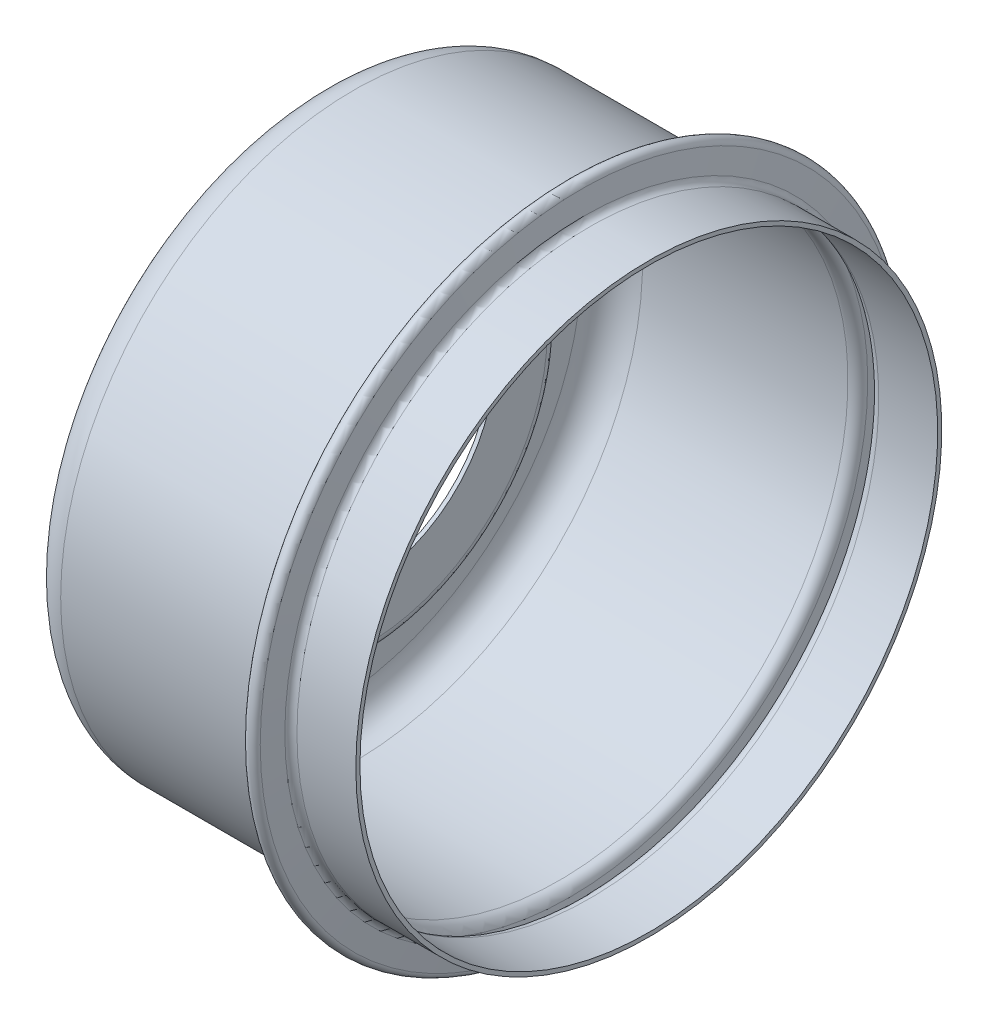
ISO-10303-21;
HEADER;
FILE_DESCRIPTION(('STEP AP214'),'2;1');
FILE_NAME('part.step','',(''),(''),'','','');
FILE_SCHEMA(('AUTOMOTIVE_DESIGN { 1 0 10303 214 1 1 1 1 }'));
ENDSEC;
DATA;
#1=APPLICATION_CONTEXT('core data for automotive mechanical design processes');
#2=APPLICATION_PROTOCOL_DEFINITION('international standard','automotive_design',2000,#1);
#3=PRODUCT_CONTEXT('',#1,'mechanical');
#4=PRODUCT('Part','Part','',(#3));
#5=PRODUCT_RELATED_PRODUCT_CATEGORY('part','',(#4));
#6=PRODUCT_DEFINITION_FORMATION('','',#4);
#7=PRODUCT_DEFINITION_CONTEXT('part definition',#1,'design');
#8=PRODUCT_DEFINITION('design','',#6,#7);
#9=PRODUCT_DEFINITION_SHAPE('','',#8);
#10=(LENGTH_UNIT() NAMED_UNIT(*) SI_UNIT(.MILLI.,.METRE.));
#11=(NAMED_UNIT(*) PLANE_ANGLE_UNIT() SI_UNIT($,.RADIAN.));
#12=(NAMED_UNIT(*) SI_UNIT($,.STERADIAN.) SOLID_ANGLE_UNIT());
#13=UNCERTAINTY_MEASURE_WITH_UNIT(LENGTH_MEASURE(1.E-05),#10,'distance_accuracy_value','');
#14=(GEOMETRIC_REPRESENTATION_CONTEXT(3) GLOBAL_UNCERTAINTY_ASSIGNED_CONTEXT((#13)) GLOBAL_UNIT_ASSIGNED_CONTEXT((#10,
#11,#12)) REPRESENTATION_CONTEXT('',''));
#15=CARTESIAN_POINT('',(0.,0.,0.));
#16=DIRECTION('',(0.,0.,1.));
#17=DIRECTION('',(1.,0.,0.));
#18=AXIS2_PLACEMENT_3D('',#15,#16,#17);
#19=CARTESIAN_POINT('',(-123.740209105341,2.22044604925031E-13,7.7715611723761E-13));
#20=DIRECTION('',(-1.,0.,0.));
#21=DIRECTION('',(0.,0.,1.));
#22=AXIS2_PLACEMENT_3D('',#19,#20,#21);
#23=CYLINDRICAL_SURFACE('',#22,34.0614);
#24=CARTESIAN_POINT('',(23.1988483706919,2.22044604925031E-13,-4.44089209850063E-13));
#25=DIRECTION('',(-1.,0.,0.));
#26=DIRECTION('',(0.,0.,1.));
#27=AXIS2_PLACEMENT_3D('',#24,#25,#26);
#28=CIRCLE('',#27,34.0614);
#29=CARTESIAN_POINT('',(23.1988483706919,2.27716967504676E-13,34.0613999999996));
#30=VERTEX_POINT('',#29);
#31=EDGE_CURVE('E650',#30,#30,#28,.T.);
#32=ORIENTED_EDGE('',*,*,#31,.F.);
#33=EDGE_LOOP('',(#32));
#34=FACE_BOUND('',#33,.T.);
#35=CARTESIAN_POINT('',(-1.01600000000002,2.22044604925031E-13,-1.11022302462516E-13));
#36=DIRECTION('',(-1.,0.,0.));
#37=DIRECTION('',(0.,0.,1.));
#38=AXIS2_PLACEMENT_3D('',#35,#36,#37);
#39=CIRCLE('',#38,34.0614);
#40=CARTESIAN_POINT('',(-1.01600000000001,2.27716967504676E-13,34.0613999999999));
#41=VERTEX_POINT('',#40);
#42=EDGE_CURVE('E653',#41,#41,#39,.T.);
#43=ORIENTED_EDGE('',*,*,#42,.T.);
#44=EDGE_LOOP('',(#43));
#45=FACE_BOUND('',#44,.T.);
#46=ADVANCED_FACE('F17',(#34,#45),#23,.F.);
#47=CARTESIAN_POINT('',(23.1988483706919,2.22044604925031E-13,-4.44089209850063E-13));
#48=DIRECTION('',(-1.,0.,0.));
#49=DIRECTION('',(0.,0.,1.));
#50=AXIS2_PLACEMENT_3D('',#47,#48,#49);
#51=TOROIDAL_SURFACE('',#50,35.3060000000011,1.2446);
#52=ORIENTED_EDGE('',*,*,#31,.T.);
#53=EDGE_LOOP('',(#52));
#54=FACE_BOUND('',#53,.T.);
#55=CARTESIAN_POINT('',(24.4348259992161,4.44089209850063E-13,1.11022302462516E-13));
#56=DIRECTION('',(1.,0.,0.));
#57=DIRECTION('',(0.,0.,-1.));
#58=AXIS2_PLACEMENT_3D('',#55,#56,#57);
#59=CIRCLE('',#58,35.1597520537313);
#60=CARTESIAN_POINT('',(24.4348259992161,4.38233934909538E-13,-35.1597520537312));
#61=VERTEX_POINT('',#60);
#62=EDGE_CURVE('E76',#61,#61,#59,.T.);
#63=ORIENTED_EDGE('',*,*,#62,.T.);
#64=EDGE_LOOP('',(#63));
#65=FACE_BOUND('',#64,.T.);
#66=ADVANCED_FACE('F621',(#54,#65),#51,.T.);
#67=CARTESIAN_POINT('',(-1.01600000000035,2.22044604925031E-13,-1.11022302462516E-13));
#68=DIRECTION('',(-1.,0.,0.));
#69=DIRECTION('',(0.,0.,1.));
#70=AXIS2_PLACEMENT_3D('',#67,#68,#69);
#71=TOROIDAL_SURFACE('',#70,30.48,3.5814);
#72=ORIENTED_EDGE('',*,*,#42,.F.);
#73=EDGE_LOOP('',(#72));
#74=FACE_BOUND('',#73,.T.);
#75=CARTESIAN_POINT('',(-4.59740000000036,2.2254162401758E-13,-1.11221110099535E-13));
#76=DIRECTION('',(-1.,0.,0.));
#77=DIRECTION('',(0.,0.,-1.));
#78=AXIS2_PLACEMENT_3D('',#75,#76,#77);
#79=CIRCLE('',#78,30.48);
#80=CARTESIAN_POINT('',(-4.59740000000031,2.22044604925031E-13,-30.4799999999999));
#81=VERTEX_POINT('',#80);
#82=CARTESIAN_POINT('',(-4.59740000000031,2.22044604925031E-13,30.4800000000006));
#83=VERTEX_POINT('',#82);
#84=EDGE_CURVE('E72',#81,#83,#79,.T.);
#85=ORIENTED_EDGE('',*,*,#84,.T.);
#86=CARTESIAN_POINT('',(-4.59740000000035,2.2254162401758E-13,-1.11221110099535E-13));
#87=DIRECTION('',(-1.,0.,0.));
#88=DIRECTION('',(0.,0.,1.));
#89=AXIS2_PLACEMENT_3D('',#86,#87,#88);
#90=CIRCLE('',#89,30.48);
#91=EDGE_CURVE('E69',#83,#81,#90,.T.);
#92=ORIENTED_EDGE('',*,*,#91,.T.);
#93=EDGE_LOOP('',(#85,#92));
#94=FACE_BOUND('',#93,.T.);
#95=ADVANCED_FACE('F73',(#74,#94),#71,.F.);
#96=CARTESIAN_POINT('',(24.7415356344131,-2.22044604925031E-13,1.11022302462516E-13));
#97=DIRECTION('',(1.,0.,0.));
#98=DIRECTION('',(0.,0.,-1.));
#99=AXIS2_PLACEMENT_3D('',#96,#97,#98);
#100=CONICAL_SURFACE('',#99,37.7518311716113,1.4530182360945);
#101=CARTESIAN_POINT('',(24.7415356344126,4.44089209850063E-13,1.11022302462516E-13));
#102=DIRECTION('',(-1.,0.,0.));
#103=DIRECTION('',(0.,0.,1.));
#104=AXIS2_PLACEMENT_3D('',#101,#102,#103);
#105=CIRCLE('',#104,37.7518311716113);
#106=CARTESIAN_POINT('',(24.7415356344126,4.50376152678335E-13,37.7518311716115));
#107=VERTEX_POINT('',#106);
#108=EDGE_CURVE('E80',#107,#107,#105,.F.);
#109=ORIENTED_EDGE('',*,*,#108,.T.);
#110=EDGE_LOOP('',(#109));
#111=FACE_BOUND('',#110,.T.);
#112=ORIENTED_EDGE('',*,*,#62,.F.);
#113=EDGE_LOOP('',(#112));
#114=FACE_BOUND('',#113,.T.);
#115=ADVANCED_FACE('F100',(#111,#114),#100,.F.);
#116=CARTESIAN_POINT('',(-4.59740000000042,30.4800000000005,0.));
#117=DIRECTION('',(-1.,0.,0.));
#118=DIRECTION('',(0.,0.,1.));
#119=AXIS2_PLACEMENT_3D('',#116,#117,#118);
#120=PLANE('',#119);
#121=CARTESIAN_POINT('',(-4.59740000000027,2.22212282044355E-13,0.));
#122=DIRECTION('',(1.,0.,0.));
#123=DIRECTION('',(0.,0.,1.));
#124=AXIS2_PLACEMENT_3D('',#121,#122,#123);
#125=CIRCLE('',#124,27.4320000000001);
#126=CARTESIAN_POINT('',(-4.5974000000002,-2.22044604925031E-13,-27.4319999999997));
#127=VERTEX_POINT('',#126);
#128=CARTESIAN_POINT('',(-4.59740000000008,2.22044604925031E-13,27.4319999999997));
#129=VERTEX_POINT('',#128);
#130=EDGE_CURVE('E158',#127,#129,#125,.F.);
#131=ORIENTED_EDGE('',*,*,#130,.T.);
#132=CARTESIAN_POINT('',(-4.59740000000027,2.22212282044355E-13,0.));
#133=DIRECTION('',(1.,0.,0.));
#134=DIRECTION('',(0.,0.,-1.));
#135=AXIS2_PLACEMENT_3D('',#132,#133,#134);
#136=CIRCLE('',#135,27.4320000000001);
#137=EDGE_CURVE('E117',#129,#127,#136,.F.);
#138=ORIENTED_EDGE('',*,*,#137,.T.);
#139=EDGE_LOOP('',(#131,#138));
#140=FACE_BOUND('',#139,.T.);
#141=ORIENTED_EDGE('',*,*,#84,.F.);
#142=ORIENTED_EDGE('',*,*,#91,.F.);
#143=EDGE_LOOP('',(#141,#142));
#144=FACE_BOUND('',#143,.T.);
#145=ADVANCED_FACE('F79',(#140,#144),#120,.F.);
#146=CARTESIAN_POINT('',(25.0189999999997,-6.66133814775094E-13,0.));
#147=DIRECTION('',(-1.,0.,0.));
#148=DIRECTION('',(0.,0.,1.));
#149=AXIS2_PLACEMENT_3D('',#146,#147,#148);
#150=TOROIDAL_SURFACE('',#149,37.7190000000004,0.279400000000002);
#151=ORIENTED_EDGE('',*,*,#108,.F.);
#152=EDGE_LOOP('',(#151));
#153=FACE_BOUND('',#152,.T.);
#154=CARTESIAN_POINT('',(25.296464365587,-2.22044604925031E-13,0.));
#155=DIRECTION('',(-1.,0.,0.));
#156=DIRECTION('',(0.,0.,1.));
#157=AXIS2_PLACEMENT_3D('',#154,#155,#156);
#158=CIRCLE('',#157,37.7518311716113);
#159=CARTESIAN_POINT('',(25.296464365587,-2.15757662096759E-13,37.7518311716114));
#160=VERTEX_POINT('',#159);
#161=EDGE_CURVE('E151',#160,#160,#158,.F.);
#162=ORIENTED_EDGE('',*,*,#161,.T.);
#163=EDGE_LOOP('',(#162));
#164=FACE_BOUND('',#163,.T.);
#165=ADVANCED_FACE('F99',(#153,#164),#150,.F.);
#166=CARTESIAN_POINT('',(-3.3891590206293,2.22044604925031E-13,0.));
#167=DIRECTION('',(-1.,0.,0.));
#168=DIRECTION('',(0.,0.,1.));
#169=AXIS2_PLACEMENT_3D('',#166,#167,#168);
#170=TOROIDAL_SURFACE('',#169,27.4320000000001,1.20824097937097);
#171=ORIENTED_EDGE('',*,*,#137,.F.);
#172=ORIENTED_EDGE('',*,*,#130,.F.);
#173=EDGE_LOOP('',(#171,#172));
#174=FACE_BOUND('',#173,.T.);
#175=CARTESIAN_POINT('',(-4.24351441044968,2.22044604925031E-13,0.));
#176=DIRECTION('',(-1.,0.,0.));
#177=DIRECTION('',(0.,0.,1.));
#178=AXIS2_PLACEMENT_3D('',#175,#176,#177);
#179=CIRCLE('',#178,26.5776446101793);
#180=CARTESIAN_POINT('',(-4.24351441044968,2.2647067187301E-13,26.5776446101793));
#181=VERTEX_POINT('',#180);
#182=EDGE_CURVE('E149',#181,#181,#179,.F.);
#183=ORIENTED_EDGE('',*,*,#182,.F.);
#184=EDGE_LOOP('',(#183));
#185=FACE_BOUND('',#184,.T.);
#186=ADVANCED_FACE('F133',(#174,#185),#170,.F.);
#187=CARTESIAN_POINT('',(25.296464365587,-2.22044604925031E-13,0.));
#188=DIRECTION('',(-1.,0.,0.));
#189=DIRECTION('',(0.,0.,1.));
#190=AXIS2_PLACEMENT_3D('',#187,#188,#189);
#191=CONICAL_SURFACE('',#190,37.7518311716113,1.45301823609451);
#192=ORIENTED_EDGE('',*,*,#161,.F.);
#193=EDGE_LOOP('',(#192));
#194=FACE_BOUND('',#193,.T.);
#195=CARTESIAN_POINT('',(25.6031740007835,-2.22044604925031E-13,5.55111512312578E-13));
#196=DIRECTION('',(-1.,0.,0.));
#197=DIRECTION('',(0.,0.,1.));
#198=AXIS2_PLACEMENT_3D('',#195,#196,#197);
#199=CIRCLE('',#198,35.1597520537313);
#200=CARTESIAN_POINT('',(25.6031740007835,-2.16189329984507E-13,35.1597520537319));
#201=VERTEX_POINT('',#200);
#202=EDGE_CURVE('E157',#201,#201,#199,.T.);
#203=ORIENTED_EDGE('',*,*,#202,.F.);
#204=EDGE_LOOP('',(#203));
#205=FACE_BOUND('',#204,.T.);
#206=ADVANCED_FACE('F143',(#194,#205),#191,.F.);
#207=CARTESIAN_POINT('',(-4.24351441044968,2.22044604925031E-13,0.));
#208=DIRECTION('',(-1.,0.,0.));
#209=DIRECTION('',(0.,0.,1.));
#210=AXIS2_PLACEMENT_3D('',#207,#208,#209);
#211=CONICAL_SURFACE('',#210,26.5776446101793,0.785398163397455);
#212=ORIENTED_EDGE('',*,*,#182,.T.);
#213=EDGE_LOOP('',(#212));
#214=FACE_BOUND('',#213,.T.);
#215=CARTESIAN_POINT('',(0.118065099864562,0.,0.));
#216=DIRECTION('',(-1.,0.,0.));
#217=DIRECTION('',(0.,0.,1.));
#218=AXIS2_PLACEMENT_3D('',#215,#216,#217);
#219=CIRCLE('',#218,22.2160650998648);
#220=CARTESIAN_POINT('',(0.118065099864564,0.,22.2160650998648));
#221=VERTEX_POINT('',#220);
#222=EDGE_CURVE('E428',#221,#221,#219,.F.);
#223=ORIENTED_EDGE('',*,*,#222,.F.);
#224=EDGE_LOOP('',(#223));
#225=FACE_BOUND('',#224,.T.);
#226=ADVANCED_FACE('F423',(#214,#225),#211,.T.);
#227=CARTESIAN_POINT('',(26.8391516293077,-2.22044604925031E-13,0.));
#228=DIRECTION('',(-1.,0.,0.));
#229=DIRECTION('',(0.,0.,1.));
#230=AXIS2_PLACEMENT_3D('',#227,#228,#229);
#231=TOROIDAL_SURFACE('',#230,35.3060000000004,1.2446);
#232=ORIENTED_EDGE('',*,*,#202,.T.);
#233=EDGE_LOOP('',(#232));
#234=FACE_BOUND('',#233,.T.);
#235=CARTESIAN_POINT('',(26.8391516293077,-2.22044604925031E-13,0.));
#236=DIRECTION('',(-1.,0.,0.));
#237=DIRECTION('',(0.,0.,1.));
#238=AXIS2_PLACEMENT_3D('',#235,#236,#237);
#239=CIRCLE('',#238,34.0614);
#240=CARTESIAN_POINT('',(26.8391516293077,-2.16372242345386E-13,34.0614));
#241=VERTEX_POINT('',#240);
#242=EDGE_CURVE('E429',#241,#241,#239,.F.);
#243=ORIENTED_EDGE('',*,*,#242,.T.);
#244=EDGE_LOOP('',(#243));
#245=FACE_BOUND('',#244,.T.);
#246=ADVANCED_FACE('F398',(#234,#245),#231,.T.);
#247=CARTESIAN_POINT('',(-0.76200000000015,2.22044604925031E-13,0.));
#248=DIRECTION('',(-1.,0.,0.));
#249=DIRECTION('',(0.,0.,1.));
#250=AXIS2_PLACEMENT_3D('',#247,#248,#249);
#251=TOROIDAL_SURFACE('',#250,21.3360000000004,1.2446);
#252=ORIENTED_EDGE('',*,*,#222,.T.);
#253=EDGE_LOOP('',(#252));
#254=FACE_BOUND('',#253,.T.);
#255=CARTESIAN_POINT('',(0.48259999999985,2.21871881977975E-13,0.));
#256=DIRECTION('',(-1.,0.,0.));
#257=DIRECTION('',(0.,0.,1.));
#258=AXIS2_PLACEMENT_3D('',#255,#256,#257);
#259=CIRCLE('',#258,21.3360000000004);
#260=CARTESIAN_POINT('',(0.482599999999556,-2.22044604925031E-13,21.3359999999997));
#261=VERTEX_POINT('',#260);
#262=CARTESIAN_POINT('',(0.482600000000111,-2.22044604925031E-13,-21.3359999999998));
#263=VERTEX_POINT('',#262);
#264=EDGE_CURVE('E670',#261,#263,#259,.T.);
#265=ORIENTED_EDGE('',*,*,#264,.T.);
#266=CARTESIAN_POINT('',(0.482599999999851,2.21871881977975E-13,0.));
#267=DIRECTION('',(-1.,0.,0.));
#268=DIRECTION('',(0.,0.,-1.));
#269=AXIS2_PLACEMENT_3D('',#266,#267,#268);
#270=CIRCLE('',#269,21.3360000000004);
#271=EDGE_CURVE('E362',#263,#261,#270,.T.);
#272=ORIENTED_EDGE('',*,*,#271,.T.);
#273=EDGE_LOOP('',(#265,#272));
#274=FACE_BOUND('',#273,.T.);
#275=ADVANCED_FACE('F394',(#254,#274),#251,.T.);
#276=CARTESIAN_POINT('',(-123.740209105341,2.22044604925031E-13,7.7715611723761E-13));
#277=DIRECTION('',(-1.,0.,0.));
#278=DIRECTION('',(0.,0.,1.));
#279=AXIS2_PLACEMENT_3D('',#276,#277,#278);
#280=CYLINDRICAL_SURFACE('',#279,34.0614);
#281=ORIENTED_EDGE('',*,*,#242,.F.);
#282=EDGE_LOOP('',(#281));
#283=FACE_BOUND('',#282,.T.);
#284=CARTESIAN_POINT('',(33.7819999999996,0.,0.));
#285=DIRECTION('',(-1.,0.,0.));
#286=DIRECTION('',(0.,0.,1.));
#287=AXIS2_PLACEMENT_3D('',#284,#285,#286);
#288=CIRCLE('',#287,34.0614);
#289=CARTESIAN_POINT('',(33.7819999999997,0.,34.0614));
#290=VERTEX_POINT('',#289);
#291=EDGE_CURVE('E668',#290,#290,#288,.T.);
#292=ORIENTED_EDGE('',*,*,#291,.F.);
#293=EDGE_LOOP('',(#292));
#294=FACE_BOUND('',#293,.T.);
#295=ADVANCED_FACE('F379',(#283,#294),#280,.F.);
#296=CARTESIAN_POINT('',(0.482599999999667,15.1130000000002,0.));
#297=DIRECTION('',(-1.,0.,0.));
#298=DIRECTION('',(0.,0.,1.));
#299=AXIS2_PLACEMENT_3D('',#296,#297,#298);
#300=PLANE('',#299);
#301=CARTESIAN_POINT('',(0.482599999999667,0.,0.));
#302=DIRECTION('',(-1.,0.,0.));
#303=DIRECTION('',(0.,0.,1.));
#304=AXIS2_PLACEMENT_3D('',#301,#302,#303);
#305=CIRCLE('',#304,15.113);
#306=CARTESIAN_POINT('',(0.482599999999668,0.,15.113));
#307=VERTEX_POINT('',#306);
#308=EDGE_CURVE('E665',#307,#307,#305,.T.);
#309=ORIENTED_EDGE('',*,*,#308,.T.);
#310=EDGE_LOOP('',(#309));
#311=FACE_BOUND('',#310,.T.);
#312=ORIENTED_EDGE('',*,*,#271,.F.);
#313=ORIENTED_EDGE('',*,*,#264,.F.);
#314=EDGE_LOOP('',(#312,#313));
#315=FACE_BOUND('',#314,.T.);
#316=ADVANCED_FACE('F368',(#311,#315),#300,.F.);
#317=CARTESIAN_POINT('',(33.7819999999999,34.5440000000004,8.88178419700125E-13));
#318=DIRECTION('',(1.,0.,0.));
#319=DIRECTION('',(0.,0.,-1.));
#320=AXIS2_PLACEMENT_3D('',#317,#318,#319);
#321=PLANE('',#320);
#322=CARTESIAN_POINT('',(33.7819999999996,0.,0.));
#323=DIRECTION('',(-1.,0.,0.));
#324=DIRECTION('',(0.,0.,1.));
#325=AXIS2_PLACEMENT_3D('',#322,#323,#324);
#326=CIRCLE('',#325,34.544);
#327=CARTESIAN_POINT('',(33.7819999999997,0.,34.544));
#328=VERTEX_POINT('',#327);
#329=EDGE_CURVE('E662',#328,#328,#326,.T.);
#330=ORIENTED_EDGE('',*,*,#329,.F.);
#331=EDGE_LOOP('',(#330));
#332=FACE_BOUND('',#331,.T.);
#333=ORIENTED_EDGE('',*,*,#291,.T.);
#334=EDGE_LOOP('',(#333));
#335=FACE_BOUND('',#334,.T.);
#336=ADVANCED_FACE('F378',(#332,#335),#321,.T.);
#337=CARTESIAN_POINT('',(-123.740209105341,2.22044604925031E-13,7.7715611723761E-13));
#338=DIRECTION('',(-1.,0.,0.));
#339=DIRECTION('',(0.,0.,1.));
#340=AXIS2_PLACEMENT_3D('',#337,#338,#339);
#341=CYLINDRICAL_SURFACE('',#340,15.113);
#342=CARTESIAN_POINT('',(0.,0.,0.));
#343=DIRECTION('',(-1.,0.,0.));
#344=DIRECTION('',(0.,0.,1.));
#345=AXIS2_PLACEMENT_3D('',#342,#343,#344);
#346=CIRCLE('',#345,15.113);
#347=CARTESIAN_POINT('',(0.,0.,15.113));
#348=VERTEX_POINT('',#347);
#349=EDGE_CURVE('E355',#348,#348,#346,.F.);
#350=ORIENTED_EDGE('',*,*,#349,.F.);
#351=EDGE_LOOP('',(#350));
#352=FACE_BOUND('',#351,.T.);
#353=ORIENTED_EDGE('',*,*,#308,.F.);
#354=EDGE_LOOP('',(#353));
#355=FACE_BOUND('',#354,.T.);
#356=ADVANCED_FACE('F476',(#352,#355),#341,.F.);
#357=CARTESIAN_POINT('',(-123.740209105341,2.22044604925031E-13,7.7715611723761E-13));
#358=DIRECTION('',(-1.,0.,0.));
#359=DIRECTION('',(0.,0.,1.));
#360=AXIS2_PLACEMENT_3D('',#357,#358,#359);
#361=CYLINDRICAL_SURFACE('',#360,34.544);
#362=ORIENTED_EDGE('',*,*,#329,.T.);
#363=EDGE_LOOP('',(#362));
#364=FACE_BOUND('',#363,.T.);
#365=CARTESIAN_POINT('',(26.8391516293077,-2.22044604925031E-13,0.));
#366=DIRECTION('',(-1.,0.,0.));
#367=DIRECTION('',(0.,0.,1.));
#368=AXIS2_PLACEMENT_3D('',#365,#366,#367);
#369=CIRCLE('',#368,34.544);
#370=CARTESIAN_POINT('',(26.8391516293077,-2.16291873300634E-13,34.5439999999999));
#371=VERTEX_POINT('',#370);
#372=EDGE_CURVE('E347',#371,#371,#369,.F.);
#373=ORIENTED_EDGE('',*,*,#372,.T.);
#374=EDGE_LOOP('',(#373));
#375=FACE_BOUND('',#374,.T.);
#376=ADVANCED_FACE('F331',(#364,#375),#361,.T.);
#377=CARTESIAN_POINT('',(-3.33066907387547E-13,15.1130000000002,6.10622663543836E-13));
#378=DIRECTION('',(-1.,0.,0.));
#379=DIRECTION('',(0.,0.,1.));
#380=AXIS2_PLACEMENT_3D('',#377,#378,#379);
#381=PLANE('',#380);
#382=ORIENTED_EDGE('',*,*,#349,.T.);
#383=EDGE_LOOP('',(#382));
#384=FACE_BOUND('',#383,.T.);
#385=CARTESIAN_POINT('',(-1.49728320020248E-13,2.21938856181936E-13,0.));
#386=DIRECTION('',(1.,0.,0.));
#387=DIRECTION('',(0.,0.,-1.));
#388=AXIS2_PLACEMENT_3D('',#385,#386,#387);
#389=CIRCLE('',#388,21.3360000000004);
#390=CARTESIAN_POINT('',(-2.22044604925031E-13,2.22044604925031E-13,21.3360000000002));
#391=VERTEX_POINT('',#390);
#392=CARTESIAN_POINT('',(-3.33066907387547E-13,4.44089209850063E-13,-21.3359999999996));
#393=VERTEX_POINT('',#392);
#394=EDGE_CURVE('E281',#391,#393,#389,.F.);
#395=ORIENTED_EDGE('',*,*,#394,.T.);
#396=CARTESIAN_POINT('',(-1.50595681758237E-13,2.21938856181936E-13,0.));
#397=DIRECTION('',(1.,0.,0.));
#398=DIRECTION('',(0.,0.,1.));
#399=AXIS2_PLACEMENT_3D('',#396,#397,#398);
#400=CIRCLE('',#399,21.3360000000004);
#401=EDGE_CURVE('E343',#393,#391,#400,.F.);
#402=ORIENTED_EDGE('',*,*,#401,.T.);
#403=EDGE_LOOP('',(#395,#402));
#404=FACE_BOUND('',#403,.T.);
#405=ADVANCED_FACE('F322',(#384,#404),#381,.T.);
#406=CARTESIAN_POINT('',(26.8391516293077,-2.22044604925031E-13,0.));
#407=DIRECTION('',(-1.,0.,0.));
#408=DIRECTION('',(0.,0.,1.));
#409=AXIS2_PLACEMENT_3D('',#406,#407,#408);
#410=TOROIDAL_SURFACE('',#409,35.3060000000004,0.761999999999996);
#411=ORIENTED_EDGE('',*,*,#372,.F.);
#412=EDGE_LOOP('',(#411));
#413=FACE_BOUND('',#412,.T.);
#414=CARTESIAN_POINT('',(26.0824306322521,-2.22044604925031E-13,0.));
#415=DIRECTION('',(-1.,0.,0.));
#416=DIRECTION('',(0.,0.,1.));
#417=AXIS2_PLACEMENT_3D('',#414,#415,#416);
#418=CIRCLE('',#417,35.21646044106);
#419=CARTESIAN_POINT('',(26.0824306322521,-2.16179886140911E-13,35.21646044106));
#420=VERTEX_POINT('',#419);
#421=EDGE_CURVE('E309',#420,#420,#418,.T.);
#422=ORIENTED_EDGE('',*,*,#421,.F.);
#423=EDGE_LOOP('',(#422));
#424=FACE_BOUND('',#423,.T.);
#425=ADVANCED_FACE('F300',(#413,#424),#410,.F.);
#426=CARTESIAN_POINT('',(-0.76200000000015,2.22044604925031E-13,0.));
#427=DIRECTION('',(-1.,0.,0.));
#428=DIRECTION('',(0.,0.,1.));
#429=AXIS2_PLACEMENT_3D('',#426,#427,#428);
#430=TOROIDAL_SURFACE('',#429,21.3360000000004,0.761999999999998);
#431=CARTESIAN_POINT('',(-0.223184632736184,2.22044604925031E-13,0.));
#432=DIRECTION('',(-1.,0.,0.));
#433=DIRECTION('',(0.,0.,1.));
#434=AXIS2_PLACEMENT_3D('',#431,#432,#433);
#435=CIRCLE('',#434,21.8748153672641);
#436=CARTESIAN_POINT('',(-0.223184632736182,2.25687493477055E-13,21.8748153672641));
#437=VERTEX_POINT('',#436);
#438=EDGE_CURVE('E311',#437,#437,#435,.T.);
#439=ORIENTED_EDGE('',*,*,#438,.T.);
#440=EDGE_LOOP('',(#439));
#441=FACE_BOUND('',#440,.T.);
#442=ORIENTED_EDGE('',*,*,#401,.F.);
#443=ORIENTED_EDGE('',*,*,#394,.F.);
#444=EDGE_LOOP('',(#442,#443));
#445=FACE_BOUND('',#444,.T.);
#446=ADVANCED_FACE('F288',(#441,#445),#430,.F.);
#447=CARTESIAN_POINT('',(25.7757209970554,4.44089209850063E-13,1.11022302462516E-13));
#448=DIRECTION('',(-1.,0.,0.));
#449=DIRECTION('',(0.,-1.,0.));
#450=AXIS2_PLACEMENT_3D('',#447,#448,#449);
#451=CONICAL_SURFACE('',#450,37.80853955894,1.45301823609451);
#452=ORIENTED_EDGE('',*,*,#421,.T.);
#453=EDGE_LOOP('',(#452));
#454=FACE_BOUND('',#453,.T.);
#455=CARTESIAN_POINT('',(25.7757209970554,4.44089209850063E-13,1.11022302462516E-13));
#456=DIRECTION('',(-1.,0.,0.));
#457=DIRECTION('',(0.,0.,1.));
#458=AXIS2_PLACEMENT_3D('',#455,#456,#457);
#459=CIRCLE('',#458,37.80853955894);
#460=CARTESIAN_POINT('',(25.7757209970554,4.50385596521931E-13,37.8085395589401));
#461=VERTEX_POINT('',#460);
#462=EDGE_CURVE('E313',#461,#461,#459,.T.);
#463=ORIENTED_EDGE('',*,*,#462,.F.);
#464=EDGE_LOOP('',(#463));
#465=FACE_BOUND('',#464,.T.);
#466=ADVANCED_FACE('F299',(#454,#465),#451,.T.);
#467=CARTESIAN_POINT('',(-4.58476414305042,2.22044604925031E-13,0.));
#468=DIRECTION('',(-1.,0.,0.));
#469=DIRECTION('',(0.,0.,1.));
#470=AXIS2_PLACEMENT_3D('',#467,#468,#469);
#471=CONICAL_SURFACE('',#470,26.2363948775787,0.785398163397454);
#472=CARTESIAN_POINT('',(-4.58476414305042,2.22044604925031E-13,0.));
#473=DIRECTION('',(-1.,0.,0.));
#474=DIRECTION('',(0.,0.,1.));
#475=AXIS2_PLACEMENT_3D('',#472,#473,#474);
#476=CIRCLE('',#475,26.2363948775787);
#477=CARTESIAN_POINT('',(-4.58476414305042,2.26413842376468E-13,26.2363948775786));
#478=VERTEX_POINT('',#477);
#479=EDGE_CURVE('E252',#478,#478,#476,.F.);
#480=ORIENTED_EDGE('',*,*,#479,.F.);
#481=EDGE_LOOP('',(#480));
#482=FACE_BOUND('',#481,.T.);
#483=ORIENTED_EDGE('',*,*,#438,.F.);
#484=EDGE_LOOP('',(#483));
#485=FACE_BOUND('',#484,.T.);
#486=ADVANCED_FACE('F509',(#482,#485),#471,.F.);
#487=CARTESIAN_POINT('',(25.0189999999997,-6.66133814775094E-13,0.));
#488=DIRECTION('',(-1.,0.,0.));
#489=DIRECTION('',(0.,0.,1.));
#490=AXIS2_PLACEMENT_3D('',#487,#488,#489);
#491=TOROIDAL_SURFACE('',#490,37.7190000000004,0.762000000000002);
#492=ORIENTED_EDGE('',*,*,#462,.T.);
#493=EDGE_LOOP('',(#492));
#494=FACE_BOUND('',#493,.T.);
#495=CARTESIAN_POINT('',(24.2622790029442,-2.22044604925031E-13,0.));
#496=DIRECTION('',(1.,0.,0.));
#497=DIRECTION('',(0.,0.,-1.));
#498=AXIS2_PLACEMENT_3D('',#495,#496,#497);
#499=CIRCLE('',#498,37.80853955894);
#500=CARTESIAN_POINT('',(24.2622790029442,-2.28340991596899E-13,-37.80853955894));
#501=VERTEX_POINT('',#500);
#502=EDGE_CURVE('E249',#501,#501,#499,.F.);
#503=ORIENTED_EDGE('',*,*,#502,.F.);
#504=EDGE_LOOP('',(#503));
#505=FACE_BOUND('',#504,.T.);
#506=ADVANCED_FACE('F260',(#494,#505),#491,.T.);
#507=CARTESIAN_POINT('',(-3.3891590206293,2.22044604925031E-13,0.));
#508=DIRECTION('',(-1.,0.,0.));
#509=DIRECTION('',(0.,0.,1.));
#510=AXIS2_PLACEMENT_3D('',#507,#508,#509);
#511=TOROIDAL_SURFACE('',#510,27.4320000000001,1.69084097937097);
#512=CARTESIAN_POINT('',(-5.08000000000027,2.22279256248316E-13,0.));
#513=DIRECTION('',(-1.,0.,0.));
#514=DIRECTION('',(0.,0.,1.));
#515=AXIS2_PLACEMENT_3D('',#512,#513,#514);
#516=CIRCLE('',#515,27.4320000000001);
#517=CARTESIAN_POINT('',(-5.08000000000031,4.44089209850063E-13,-27.4320000000001));
#518=VERTEX_POINT('',#517);
#519=CARTESIAN_POINT('',(-5.08000000000008,2.22044604925031E-13,27.4320000000001));
#520=VERTEX_POINT('',#519);
#521=EDGE_CURVE('E727',#518,#520,#516,.F.);
#522=ORIENTED_EDGE('',*,*,#521,.F.);
#523=CARTESIAN_POINT('',(-5.08000000000028,2.22279256248316E-13,0.));
#524=DIRECTION('',(-1.,0.,0.));
#525=DIRECTION('',(0.,0.,-1.));
#526=AXIS2_PLACEMENT_3D('',#523,#524,#525);
#527=CIRCLE('',#526,27.4320000000001);
#528=EDGE_CURVE('E196',#520,#518,#527,.F.);
#529=ORIENTED_EDGE('',*,*,#528,.F.);
#530=EDGE_LOOP('',(#522,#529));
#531=FACE_BOUND('',#530,.T.);
#532=ORIENTED_EDGE('',*,*,#479,.T.);
#533=EDGE_LOOP('',(#532));
#534=FACE_BOUND('',#533,.T.);
#535=ADVANCED_FACE('F256',(#531,#534),#511,.T.);
#536=CARTESIAN_POINT('',(24.2622790029442,-2.22044604925031E-13,0.));
#537=DIRECTION('',(1.,0.,0.));
#538=DIRECTION('',(0.,1.,0.));
#539=AXIS2_PLACEMENT_3D('',#536,#537,#538);
#540=CONICAL_SURFACE('',#539,37.80853955894,1.4530182360945);
#541=CARTESIAN_POINT('',(23.9555693677475,4.44089209850063E-13,1.11022302462516E-13));
#542=DIRECTION('',(-1.,0.,0.));
#543=DIRECTION('',(0.,0.,1.));
#544=AXIS2_PLACEMENT_3D('',#541,#542,#543);
#545=CIRCLE('',#544,35.21646044106);
#546=CARTESIAN_POINT('',(23.9555693677475,4.49953928634183E-13,35.2164604410601));
#547=VERTEX_POINT('',#546);
#548=EDGE_CURVE('E192',#547,#547,#545,.F.);
#549=ORIENTED_EDGE('',*,*,#548,.T.);
#550=EDGE_LOOP('',(#549));
#551=FACE_BOUND('',#550,.T.);
#552=ORIENTED_EDGE('',*,*,#502,.T.);
#553=EDGE_LOOP('',(#552));
#554=FACE_BOUND('',#553,.T.);
#555=ADVANCED_FACE('F212',(#551,#554),#540,.T.);
#556=CARTESIAN_POINT('',(-5.0800000000002,30.4800000000003,4.9960036108132E-13));
#557=DIRECTION('',(-1.,0.,0.));
#558=DIRECTION('',(0.,0.,1.));
#559=AXIS2_PLACEMENT_3D('',#556,#557,#558);
#560=PLANE('',#559);
#561=ORIENTED_EDGE('',*,*,#521,.T.);
#562=ORIENTED_EDGE('',*,*,#528,.T.);
#563=EDGE_LOOP('',(#561,#562));
#564=FACE_BOUND('',#563,.T.);
#565=CARTESIAN_POINT('',(-5.08000000000036,2.22608598221541E-13,-1.1124789978112E-13));
#566=DIRECTION('',(1.,0.,0.));
#567=DIRECTION('',(0.,0.,-1.));
#568=AXIS2_PLACEMENT_3D('',#565,#566,#567);
#569=CIRCLE('',#568,30.48);
#570=CARTESIAN_POINT('',(-5.08000000000042,2.22044604925031E-13,30.4799999999997));
#571=VERTEX_POINT('',#570);
#572=CARTESIAN_POINT('',(-5.0800000000002,2.22044604925031E-13,-30.4799999999994));
#573=VERTEX_POINT('',#572);
#574=EDGE_CURVE('E36',#571,#573,#569,.F.);
#575=ORIENTED_EDGE('',*,*,#574,.T.);
#576=CARTESIAN_POINT('',(-5.08000000000035,2.22608598221541E-13,-1.1124789978112E-13));
#577=DIRECTION('',(1.,0.,0.));
#578=DIRECTION('',(0.,0.,1.));
#579=AXIS2_PLACEMENT_3D('',#576,#577,#578);
#580=CIRCLE('',#579,30.48);
#581=EDGE_CURVE('E195',#571,#573,#580,.T.);
#582=ORIENTED_EDGE('',*,*,#581,.F.);
#583=EDGE_LOOP('',(#575,#582));
#584=FACE_BOUND('',#583,.T.);
#585=ADVANCED_FACE('F203',(#564,#584),#560,.T.);
#586=CARTESIAN_POINT('',(23.1988483706919,2.22044604925031E-13,-4.44089209850063E-13));
#587=DIRECTION('',(-1.,0.,0.));
#588=DIRECTION('',(0.,0.,1.));
#589=AXIS2_PLACEMENT_3D('',#586,#587,#588);
#590=TOROIDAL_SURFACE('',#589,35.3060000000011,0.761999999999996);
#591=ORIENTED_EDGE('',*,*,#548,.F.);
#592=EDGE_LOOP('',(#591));
#593=FACE_BOUND('',#592,.T.);
#594=CARTESIAN_POINT('',(23.1988483706919,2.22044604925031E-13,-4.44089209850063E-13));
#595=DIRECTION('',(-1.,0.,0.));
#596=DIRECTION('',(0.,0.,1.));
#597=AXIS2_PLACEMENT_3D('',#594,#595,#596);
#598=CIRCLE('',#597,34.544);
#599=CARTESIAN_POINT('',(23.1988483706919,2.27797336549429E-13,34.5439999999996));
#600=VERTEX_POINT('',#599);
#601=EDGE_CURVE('E28',#600,#600,#598,.T.);
#602=ORIENTED_EDGE('',*,*,#601,.F.);
#603=EDGE_LOOP('',(#602));
#604=FACE_BOUND('',#603,.T.);
#605=ADVANCED_FACE('F176',(#593,#604),#590,.F.);
#606=CARTESIAN_POINT('',(-1.01600000000035,2.22044604925031E-13,-1.11022302462516E-13));
#607=DIRECTION('',(-1.,0.,0.));
#608=DIRECTION('',(0.,0.,1.));
#609=AXIS2_PLACEMENT_3D('',#606,#607,#608);
#610=TOROIDAL_SURFACE('',#609,30.48,4.064);
#611=CARTESIAN_POINT('',(-1.01600000000002,2.22044604925031E-13,-1.11022302462516E-13));
#612=DIRECTION('',(-1.,0.,0.));
#613=DIRECTION('',(0.,0.,1.));
#614=AXIS2_PLACEMENT_3D('',#611,#612,#613);
#615=CIRCLE('',#614,34.544);
#616=CARTESIAN_POINT('',(-1.01600000000001,2.27797336549429E-13,34.5439999999999));
#617=VERTEX_POINT('',#616);
#618=EDGE_CURVE('E11',#617,#617,#615,.F.);
#619=ORIENTED_EDGE('',*,*,#618,.F.);
#620=EDGE_LOOP('',(#619));
#621=FACE_BOUND('',#620,.T.);
#622=ORIENTED_EDGE('',*,*,#581,.T.);
#623=ORIENTED_EDGE('',*,*,#574,.F.);
#624=EDGE_LOOP('',(#622,#623));
#625=FACE_BOUND('',#624,.T.);
#626=ADVANCED_FACE('F170',(#621,#625),#610,.T.);
#627=CARTESIAN_POINT('',(-123.740209105341,2.22044604925031E-13,7.7715611723761E-13));
#628=DIRECTION('',(-1.,0.,0.));
#629=DIRECTION('',(0.,0.,1.));
#630=AXIS2_PLACEMENT_3D('',#627,#628,#629);
#631=CYLINDRICAL_SURFACE('',#630,34.544);
#632=ORIENTED_EDGE('',*,*,#601,.T.);
#633=EDGE_LOOP('',(#632));
#634=FACE_BOUND('',#633,.T.);
#635=ORIENTED_EDGE('',*,*,#618,.T.);
#636=EDGE_LOOP('',(#635));
#637=FACE_BOUND('',#636,.T.);
#638=ADVANCED_FACE('F168',(#634,#637),#631,.T.);
#639=CLOSED_SHELL('',(#46,#66,#95,#115,#145,#165,#186,#206,#226,#246,#275,#295,#316,#336,#356,
#376,#405,#425,#446,#466,#486,#506,#535,#555,#585,#605,#626,#638));
#640=MANIFOLD_SOLID_BREP('B1',#639);
#641=ADVANCED_BREP_SHAPE_REPRESENTATION('',(#18,#640),#14);
#642=SHAPE_DEFINITION_REPRESENTATION(#9,#641);
ENDSEC;
END-ISO-10303-21;
